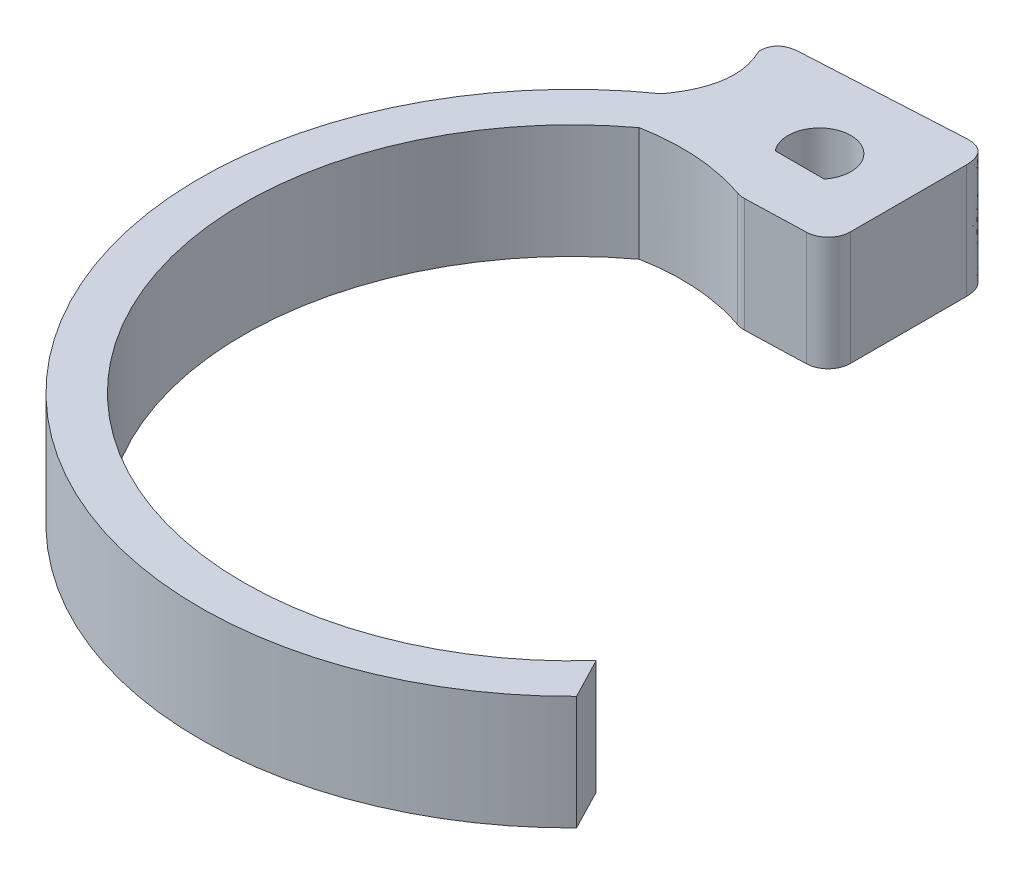
ISO-10303-21;
HEADER;
FILE_DESCRIPTION(('STEP AP214'),'2;1');
FILE_NAME('part.step','',(''),(''),'','','');
FILE_SCHEMA(('AUTOMOTIVE_DESIGN { 1 0 10303 214 1 1 1 1 }'));
ENDSEC;
DATA;
#1=APPLICATION_CONTEXT('core data for automotive mechanical design processes');
#2=APPLICATION_PROTOCOL_DEFINITION('international standard','automotive_design',2000,#1);
#3=PRODUCT_CONTEXT('',#1,'mechanical');
#4=PRODUCT('Part','Part','',(#3));
#5=PRODUCT_RELATED_PRODUCT_CATEGORY('part','',(#4));
#6=PRODUCT_DEFINITION_FORMATION('','',#4);
#7=PRODUCT_DEFINITION_CONTEXT('part definition',#1,'design');
#8=PRODUCT_DEFINITION('design','',#6,#7);
#9=PRODUCT_DEFINITION_SHAPE('','',#8);
#10=(LENGTH_UNIT() NAMED_UNIT(*) SI_UNIT(.MILLI.,.METRE.));
#11=(NAMED_UNIT(*) PLANE_ANGLE_UNIT() SI_UNIT($,.RADIAN.));
#12=(NAMED_UNIT(*) SI_UNIT($,.STERADIAN.) SOLID_ANGLE_UNIT());
#13=UNCERTAINTY_MEASURE_WITH_UNIT(LENGTH_MEASURE(1.E-05),#10,'distance_accuracy_value','');
#14=(GEOMETRIC_REPRESENTATION_CONTEXT(3) GLOBAL_UNCERTAINTY_ASSIGNED_CONTEXT((#13)) GLOBAL_UNIT_ASSIGNED_CONTEXT((#10,
#11,#12)) REPRESENTATION_CONTEXT('',''));
#15=CARTESIAN_POINT('',(0.,0.,0.));
#16=DIRECTION('',(0.,0.,1.));
#17=DIRECTION('',(1.,0.,0.));
#18=AXIS2_PLACEMENT_3D('',#15,#16,#17);
#19=CARTESIAN_POINT('',(-33.0285326066637,6.35,3.74643759327143));
#20=DIRECTION('',(0.,1.,0.));
#21=DIRECTION('',(0.,0.,1.));
#22=AXIS2_PLACEMENT_3D('',#19,#20,#21);
#23=PLANE('',#22);
#24=CARTESIAN_POINT('',(-32.3270124118758,6.35,5.73195544484965));
#25=CARTESIAN_POINT('',(-32.3913833550748,6.35,3.02906188953559));
#26=CARTESIAN_POINT('',(-35.0043513046294,6.35,3.19567114916487));
#27=B_SPLINE_CURVE_WITH_KNOTS('',2,(#24,#25,#26),.UNSPECIFIED.,.F.,.F.,(3,3),(0.,1.),.UNSPECIFIED.);
#28=CARTESIAN_POINT('',(-32.3270124118758,6.35,5.73195544484965));
#29=VERTEX_POINT('',#28);
#30=CARTESIAN_POINT('',(-35.0043513046294,6.35,3.19567114916487));
#31=VERTEX_POINT('',#30);
#32=EDGE_CURVE('E151',#29,#31,#27,.T.);
#33=ORIENTED_EDGE('',*,*,#32,.T.);
#34=DIRECTION('',(-0.998537124285345,0.,0.0540704302179459));
#35=VECTOR('',#34,1.);
#36=CARTESIAN_POINT('',(-52.6004804238313,6.35,4.14849528409798));
#37=LINE('',#36,#35);
#38=CARTESIAN_POINT('',(-52.6004804238313,6.35,4.14849528409798));
#39=VERTEX_POINT('',#38);
#40=EDGE_CURVE('E157',#31,#39,#37,.T.);
#41=ORIENTED_EDGE('',*,*,#40,.T.);
#42=CARTESIAN_POINT('',(-52.6004804238313,6.35,4.14849528409798));
#43=CARTESIAN_POINT('',(-54.8334974610543,6.35,4.29365848902988));
#44=CARTESIAN_POINT('',(-54.8663433490591,6.35,6.3089129925957));
#45=B_SPLINE_CURVE_WITH_KNOTS('',2,(#42,#43,#44),.UNSPECIFIED.,.F.,.F.,(3,3),(0.,1.),.UNSPECIFIED.);
#46=CARTESIAN_POINT('',(-54.8663433490591,6.35,6.3089129925957));
#47=VERTEX_POINT('',#46);
#48=EDGE_CURVE('E163',#39,#47,#45,.T.);
#49=ORIENTED_EDGE('',*,*,#48,.T.);
#50=CARTESIAN_POINT('',(-54.8663433490591,6.35,6.3089129925957));
#51=CARTESIAN_POINT('',(-52.5564098502214,6.35,10.9635190777014));
#52=CARTESIAN_POINT('',(-56.1771965860345,6.35,15.8622607463249));
#53=B_SPLINE_CURVE_WITH_KNOTS('',2,(#50,#51,#52),.UNSPECIFIED.,.F.,.F.,(3,3),(0.,1.),.UNSPECIFIED.);
#54=CARTESIAN_POINT('',(-56.1771965860345,6.35,15.8622607463249));
#55=VERTEX_POINT('',#54);
#56=EDGE_CURVE('E168',#47,#55,#53,.T.);
#57=ORIENTED_EDGE('',*,*,#56,.T.);
#58=CARTESIAN_POINT('',(-32.3270124118697,6.35,49.7143221183813));
#59=DIRECTION('',(0.,1.,0.));
#60=DIRECTION('',(0.,0.,1.));
#61=AXIS2_PLACEMENT_3D('',#58,#59,#60);
#62=CIRCLE('',#61,41.41006332136);
#63=CARTESIAN_POINT('',(-2.77320312475359,6.35,78.7206266210203));
#64=VERTEX_POINT('',#63);
#65=EDGE_CURVE('E337',#55,#64,#62,.T.);
#66=ORIENTED_EDGE('',*,*,#65,.T.);
#67=DIRECTION('',(-0.460408200033211,0.,-0.887707321892852));
#68=VECTOR('',#67,1.);
#69=CARTESIAN_POINT('',(-2.7732031247536,6.35,78.7206266210203));
#70=LINE('',#69,#68);
#71=CARTESIAN_POINT('',(-5.13477903340686,6.35,74.1673014952601));
#72=VERTEX_POINT('',#71);
#73=EDGE_CURVE('E338',#64,#72,#70,.T.);
#74=ORIENTED_EDGE('',*,*,#73,.T.);
#75=CARTESIAN_POINT('',(-32.3270124118697,6.35,49.7143221183813));
#76=DIRECTION('',(0.,-1.,0.));
#77=DIRECTION('',(0.,0.,1.));
#78=AXIS2_PLACEMENT_3D('',#75,#76,#77);
#79=CIRCLE('',#78,36.5700117106196);
#80=CARTESIAN_POINT('',(-54.151069136961,6.35,20.370220418468));
#81=VERTEX_POINT('',#80);
#82=EDGE_CURVE('E232',#72,#81,#79,.T.);
#83=ORIENTED_EDGE('',*,*,#82,.T.);
#84=CARTESIAN_POINT('',(-54.151069136961,6.35,20.370220418468));
#85=CARTESIAN_POINT('',(-50.0948789713038,6.35,19.6117689944451));
#86=CARTESIAN_POINT('',(-46.1430887678935,6.35,19.8926648910228));
#87=CARTESIAN_POINT('',(-42.3517683257354,6.35,21.2019604756439));
#88=B_SPLINE_CURVE_WITH_KNOTS('',3,(#84,#85,#86,#87),.UNSPECIFIED.,.F.,.F.,(4,4),
(0.0362713261030514,1.),.UNSPECIFIED.);
#89=CARTESIAN_POINT('',(-42.3517683257354,6.35,21.2019604756439));
#90=VERTEX_POINT('',#89);
#91=EDGE_CURVE('E225',#81,#90,#88,.T.);
#92=ORIENTED_EDGE('',*,*,#91,.T.);
#93=CARTESIAN_POINT('',(-41.5226520200899,6.35,18.8010926842583));
#94=DIRECTION('',(0.,1.,0.));
#95=DIRECTION('',(0.,0.,1.));
#96=AXIS2_PLACEMENT_3D('',#93,#94,#95);
#97=CIRCLE('',#96,2.54);
#98=CARTESIAN_POINT('',(-41.4470538071266,6.35,21.3399674173235));
#99=VERTEX_POINT('',#98);
#100=EDGE_CURVE('E231',#90,#99,#97,.T.);
#101=ORIENTED_EDGE('',*,*,#100,.T.);
#102=DIRECTION('',(0.999556981521721,0.,-0.0297630759698373));
#103=VECTOR('',#102,1.);
#104=CARTESIAN_POINT('',(-41.4470538071266,6.35,21.3399674173235));
#105=LINE('',#104,#103);
#106=CARTESIAN_POINT('',(-34.7304865443092,6.35,21.139973114452));
#107=VERTEX_POINT('',#106);
#108=EDGE_CURVE('E238',#99,#107,#105,.T.);
#109=ORIENTED_EDGE('',*,*,#108,.T.);
#110=CARTESIAN_POINT('',(-34.8042157350084,6.35,18.663867238166));
#111=DIRECTION('',(0.,1.,0.));
#112=DIRECTION('',(0.,0.,-1.));
#113=AXIS2_PLACEMENT_3D('',#110,#111,#112);
#114=CIRCLE('',#113,2.47720332313253);
#115=CARTESIAN_POINT('',(-32.3270124118758,6.35,18.663867238166));
#116=VERTEX_POINT('',#115);
#117=EDGE_CURVE('E240',#107,#116,#114,.T.);
#118=ORIENTED_EDGE('',*,*,#117,.T.);
#119=DIRECTION('',(0.,0.,-1.));
#120=VECTOR('',#119,1.);
#121=CARTESIAN_POINT('',(-32.3270124118758,6.35,5.73195544484965));
#122=LINE('',#121,#120);
#123=EDGE_CURVE('E242',#116,#29,#122,.T.);
#124=ORIENTED_EDGE('',*,*,#123,.T.);
#125=EDGE_LOOP('',(#33,#41,#49,#57,#66,#74,#83,#92,#101,#109,#118,#124));
#126=FACE_BOUND('',#125,.T.);
#127=DIRECTION('',(-1.,0.,0.));
#128=VECTOR('',#127,1.);
#129=CARTESIAN_POINT('',(-33.0285326066637,6.35,15.0290664283578));
#130=LINE('',#129,#128);
#131=CARTESIAN_POINT('',(-38.8792295394898,6.35,15.0290664283578));
#132=VERTEX_POINT('',#131);
#133=CARTESIAN_POINT('',(-44.328612101864,6.35,15.0290664283578));
#134=VERTEX_POINT('',#133);
#135=EDGE_CURVE('E135',#132,#134,#130,.T.);
#136=ORIENTED_EDGE('',*,*,#135,.T.);
#137=CARTESIAN_POINT('',(-41.6039208206769,6.35,12.8322374813928));
#138=DIRECTION('',(0.,1.,0.));
#139=DIRECTION('',(0.,0.,1.));
#140=AXIS2_PLACEMENT_3D('',#137,#138,#139);
#141=CIRCLE('',#140,3.5);
#142=EDGE_CURVE('E139',#134,#132,#141,.F.);
#143=ORIENTED_EDGE('',*,*,#142,.T.);
#144=EDGE_LOOP('',(#136,#143));
#145=FACE_BOUND('',#144,.T.);
#146=ADVANCED_FACE('F37',(#126,#145),#23,.T.);
#147=CARTESIAN_POINT('',(-33.0285326066637,-6.35,3.74643759327143));
#148=DIRECTION('',(0.,1.,0.));
#149=DIRECTION('',(0.,0.,1.));
#150=AXIS2_PLACEMENT_3D('',#147,#148,#149);
#151=PLANE('',#150);
#152=CARTESIAN_POINT('',(-32.3270124118758,-6.35,5.73195544484965));
#153=CARTESIAN_POINT('',(-32.3913833550748,-6.35,3.02906188953559));
#154=CARTESIAN_POINT('',(-35.0043513046294,-6.35,3.19567114916487));
#155=B_SPLINE_CURVE_WITH_KNOTS('',2,(#152,#153,#154),.UNSPECIFIED.,.F.,.F.,(3,3),(0.,1.),.UNSPECIFIED.);
#156=CARTESIAN_POINT('',(-32.3270124118758,-6.35,5.73195544484965));
#157=VERTEX_POINT('',#156);
#158=CARTESIAN_POINT('',(-35.0043513046294,-6.35,3.19567114916487));
#159=VERTEX_POINT('',#158);
#160=EDGE_CURVE('E146',#157,#159,#155,.T.);
#161=ORIENTED_EDGE('',*,*,#160,.F.);
#162=DIRECTION('',(0.,0.,-1.));
#163=VECTOR('',#162,1.);
#164=CARTESIAN_POINT('',(-32.3270124118758,-6.35,5.73195544484965));
#165=LINE('',#164,#163);
#166=CARTESIAN_POINT('',(-32.3270124118758,-6.35,18.663867238166));
#167=VERTEX_POINT('',#166);
#168=EDGE_CURVE('E158',#167,#157,#165,.T.);
#169=ORIENTED_EDGE('',*,*,#168,.F.);
#170=CARTESIAN_POINT('',(-34.8042157350084,-6.35,18.663867238166));
#171=DIRECTION('',(0.,1.,0.));
#172=DIRECTION('',(0.,0.,-1.));
#173=AXIS2_PLACEMENT_3D('',#170,#171,#172);
#174=CIRCLE('',#173,2.47720332313253);
#175=CARTESIAN_POINT('',(-34.7304865443092,-6.35,21.139973114452));
#176=VERTEX_POINT('',#175);
#177=EDGE_CURVE('E282',#176,#167,#174,.T.);
#178=ORIENTED_EDGE('',*,*,#177,.F.);
#179=DIRECTION('',(0.999556981521721,0.,-0.0297630759698373));
#180=VECTOR('',#179,1.);
#181=CARTESIAN_POINT('',(-41.4470538071266,-6.35,21.3399674173235));
#182=LINE('',#181,#180);
#183=CARTESIAN_POINT('',(-41.4470538071266,-6.35,21.3399674173235));
#184=VERTEX_POINT('',#183);
#185=EDGE_CURVE('E280',#184,#176,#182,.T.);
#186=ORIENTED_EDGE('',*,*,#185,.F.);
#187=CARTESIAN_POINT('',(-41.5226520200899,-6.35,18.8010926842583));
#188=DIRECTION('',(0.,1.,0.));
#189=DIRECTION('',(0.,0.,1.));
#190=AXIS2_PLACEMENT_3D('',#187,#188,#189);
#191=CIRCLE('',#190,2.54);
#192=CARTESIAN_POINT('',(-42.3517683257354,-6.35,21.2019604756439));
#193=VERTEX_POINT('',#192);
#194=EDGE_CURVE('E275',#193,#184,#191,.T.);
#195=ORIENTED_EDGE('',*,*,#194,.F.);
#196=CARTESIAN_POINT('',(-54.151069136961,-6.35,20.370220418468));
#197=CARTESIAN_POINT('',(-50.0948789713038,-6.35,19.6117689944451));
#198=CARTESIAN_POINT('',(-46.1430887678935,-6.35,19.8926648910228));
#199=CARTESIAN_POINT('',(-42.3517683257354,-6.35,21.2019604756439));
#200=B_SPLINE_CURVE_WITH_KNOTS('',3,(#196,#197,#198,#199),.UNSPECIFIED.,.F.,.F.,(4,4),
(0.0362713261030514,1.),.UNSPECIFIED.);
#201=CARTESIAN_POINT('',(-54.151069136961,-6.35,20.370220418468));
#202=VERTEX_POINT('',#201);
#203=EDGE_CURVE('E271',#202,#193,#200,.T.);
#204=ORIENTED_EDGE('',*,*,#203,.F.);
#205=CARTESIAN_POINT('',(-32.3270124118697,-6.35,49.7143221183813));
#206=DIRECTION('',(0.,-1.,0.));
#207=DIRECTION('',(0.,0.,1.));
#208=AXIS2_PLACEMENT_3D('',#205,#206,#207);
#209=CIRCLE('',#208,36.5700117106196);
#210=CARTESIAN_POINT('',(-5.13477903340686,-6.35,74.1673014952601));
#211=VERTEX_POINT('',#210);
#212=EDGE_CURVE('E269',#211,#202,#209,.T.);
#213=ORIENTED_EDGE('',*,*,#212,.F.);
#214=DIRECTION('',(-0.460408200033211,0.,-0.887707321892852));
#215=VECTOR('',#214,1.);
#216=CARTESIAN_POINT('',(-2.7732031247536,-6.35,78.7206266210203));
#217=LINE('',#216,#215);
#218=CARTESIAN_POINT('',(-2.77320312475359,-6.35,78.7206266210203));
#219=VERTEX_POINT('',#218);
#220=EDGE_CURVE('E267',#219,#211,#217,.T.);
#221=ORIENTED_EDGE('',*,*,#220,.F.);
#222=CARTESIAN_POINT('',(-32.3270124118697,-6.35,49.7143221183813));
#223=DIRECTION('',(0.,1.,0.));
#224=DIRECTION('',(0.,0.,1.));
#225=AXIS2_PLACEMENT_3D('',#222,#223,#224);
#226=CIRCLE('',#225,41.41006332136);
#227=CARTESIAN_POINT('',(-56.1771965860345,-6.35,15.8622607463249));
#228=VERTEX_POINT('',#227);
#229=EDGE_CURVE('E262',#228,#219,#226,.T.);
#230=ORIENTED_EDGE('',*,*,#229,.F.);
#231=CARTESIAN_POINT('',(-54.8663433490591,-6.35,6.3089129925957));
#232=CARTESIAN_POINT('',(-52.5564098502214,-6.35,10.9635190777014));
#233=CARTESIAN_POINT('',(-56.1771965860345,-6.35,15.8622607463249));
#234=B_SPLINE_CURVE_WITH_KNOTS('',2,(#231,#232,#233),.UNSPECIFIED.,.F.,.F.,(3,3),(0.,1.),.UNSPECIFIED.);
#235=CARTESIAN_POINT('',(-54.8663433490591,-6.35,6.3089129925957));
#236=VERTEX_POINT('',#235);
#237=EDGE_CURVE('E255',#236,#228,#234,.T.);
#238=ORIENTED_EDGE('',*,*,#237,.F.);
#239=CARTESIAN_POINT('',(-52.6004804238313,-6.35,4.14849528409798));
#240=CARTESIAN_POINT('',(-54.8334974610543,-6.35,4.29365848902988));
#241=CARTESIAN_POINT('',(-54.8663433490591,-6.35,6.3089129925957));
#242=B_SPLINE_CURVE_WITH_KNOTS('',2,(#239,#240,#241),.UNSPECIFIED.,.F.,.F.,(3,3),(0.,1.),.UNSPECIFIED.);
#243=CARTESIAN_POINT('',(-52.6004804238313,-6.35,4.14849528409798));
#244=VERTEX_POINT('',#243);
#245=EDGE_CURVE('E251',#244,#236,#242,.T.);
#246=ORIENTED_EDGE('',*,*,#245,.F.);
#247=DIRECTION('',(-0.998537124285345,0.,0.0540704302179459));
#248=VECTOR('',#247,1.);
#249=CARTESIAN_POINT('',(-52.6004804238313,-6.35,4.14849528409798));
#250=LINE('',#249,#248);
#251=EDGE_CURVE('E149',#159,#244,#250,.T.);
#252=ORIENTED_EDGE('',*,*,#251,.F.);
#253=EDGE_LOOP('',(#161,#169,#178,#186,#195,#204,#213,#221,#230,#238,#246,#252));
#254=FACE_BOUND('',#253,.T.);
#255=CARTESIAN_POINT('',(-41.6039208206769,-6.35,12.8322374813928));
#256=DIRECTION('',(0.,1.,0.));
#257=DIRECTION('',(0.,0.,1.));
#258=AXIS2_PLACEMENT_3D('',#255,#256,#257);
#259=CIRCLE('',#258,3.5);
#260=CARTESIAN_POINT('',(-44.328612101864,-6.35,15.0290664283578));
#261=VERTEX_POINT('',#260);
#262=CARTESIAN_POINT('',(-38.8792295394898,-6.35,15.0290664283578));
#263=VERTEX_POINT('',#262);
#264=EDGE_CURVE('E11',#261,#263,#259,.F.);
#265=ORIENTED_EDGE('',*,*,#264,.F.);
#266=DIRECTION('',(-1.,0.,0.));
#267=VECTOR('',#266,1.);
#268=CARTESIAN_POINT('',(-33.0285326066637,-6.35,15.0290664283578));
#269=LINE('',#268,#267);
#270=EDGE_CURVE('E46',#263,#261,#269,.T.);
#271=ORIENTED_EDGE('',*,*,#270,.F.);
#272=EDGE_LOOP('',(#265,#271));
#273=FACE_BOUND('',#272,.T.);
#274=ADVANCED_FACE('F189',(#254,#273),#151,.F.);
#275=DIRECTION('',(0.,-1.,0.));
#276=VECTOR('',#275,1.);
#277=SURFACE_OF_LINEAR_EXTRUSION('',#27,#276);
#278=ORIENTED_EDGE('',*,*,#160,.T.);
#279=DIRECTION('',(0.,-1.,0.));
#280=VECTOR('',#279,1.);
#281=CARTESIAN_POINT('',(-35.0043513046294,6.35,3.19567114916487));
#282=LINE('',#281,#280);
#283=EDGE_CURVE('E317',#31,#159,#282,.T.);
#284=ORIENTED_EDGE('',*,*,#283,.F.);
#285=ORIENTED_EDGE('',*,*,#32,.F.);
#286=DIRECTION('',(0.,-1.,0.));
#287=VECTOR('',#286,1.);
#288=CARTESIAN_POINT('',(-32.3270124118758,6.35,5.73195544484965));
#289=LINE('',#288,#287);
#290=EDGE_CURVE('E243',#29,#157,#289,.T.);
#291=ORIENTED_EDGE('',*,*,#290,.T.);
#292=EDGE_LOOP('',(#278,#284,#285,#291));
#293=FACE_BOUND('',#292,.T.);
#294=ADVANCED_FACE('F39',(#293),#277,.F.);
#295=CARTESIAN_POINT('',(-52.6004804238313,6.35,4.14849528409798));
#296=DIRECTION('',(0.054070430217946,0.,0.998537124285345));
#297=DIRECTION('',(0.998537124285345,0.,-0.054070430217946));
#298=AXIS2_PLACEMENT_3D('',#295,#296,#297);
#299=PLANE('',#298);
#300=ORIENTED_EDGE('',*,*,#251,.T.);
#301=DIRECTION('',(0.,-1.,0.));
#302=VECTOR('',#301,1.);
#303=CARTESIAN_POINT('',(-52.6004804238313,6.35,4.14849528409798));
#304=LINE('',#303,#302);
#305=EDGE_CURVE('E314',#39,#244,#304,.T.);
#306=ORIENTED_EDGE('',*,*,#305,.F.);
#307=ORIENTED_EDGE('',*,*,#40,.F.);
#308=ORIENTED_EDGE('',*,*,#283,.T.);
#309=EDGE_LOOP('',(#300,#306,#307,#308));
#310=FACE_BOUND('',#309,.T.);
#311=ADVANCED_FACE('F181',(#310),#299,.F.);
#312=DIRECTION('',(0.,-1.,0.));
#313=VECTOR('',#312,1.);
#314=SURFACE_OF_LINEAR_EXTRUSION('',#45,#313);
#315=ORIENTED_EDGE('',*,*,#245,.T.);
#316=DIRECTION('',(0.,-1.,0.));
#317=VECTOR('',#316,1.);
#318=CARTESIAN_POINT('',(-54.8663433490591,6.35,6.3089129925957));
#319=LINE('',#318,#317);
#320=EDGE_CURVE('E311',#47,#236,#319,.T.);
#321=ORIENTED_EDGE('',*,*,#320,.F.);
#322=ORIENTED_EDGE('',*,*,#48,.F.);
#323=ORIENTED_EDGE('',*,*,#305,.T.);
#324=EDGE_LOOP('',(#315,#321,#322,#323));
#325=FACE_BOUND('',#324,.T.);
#326=ADVANCED_FACE('F177',(#325),#314,.F.);
#327=DIRECTION('',(0.,-1.,0.));
#328=VECTOR('',#327,1.);
#329=SURFACE_OF_LINEAR_EXTRUSION('',#53,#328);
#330=ORIENTED_EDGE('',*,*,#237,.T.);
#331=DIRECTION('',(0.,-1.,0.));
#332=VECTOR('',#331,1.);
#333=CARTESIAN_POINT('',(-56.1771965860345,6.35,15.8622607463249));
#334=LINE('',#333,#332);
#335=EDGE_CURVE('E308',#55,#228,#334,.T.);
#336=ORIENTED_EDGE('',*,*,#335,.F.);
#337=ORIENTED_EDGE('',*,*,#56,.F.);
#338=ORIENTED_EDGE('',*,*,#320,.T.);
#339=EDGE_LOOP('',(#330,#336,#337,#338));
#340=FACE_BOUND('',#339,.T.);
#341=ADVANCED_FACE('F180',(#340),#329,.F.);
#342=CARTESIAN_POINT('',(-32.3270124118697,6.35,49.7143221183813));
#343=DIRECTION('',(0.,-1.,0.));
#344=DIRECTION('',(0.,0.,-1.));
#345=AXIS2_PLACEMENT_3D('',#342,#343,#344);
#346=CYLINDRICAL_SURFACE('',#345,41.41006332136);
#347=ORIENTED_EDGE('',*,*,#229,.T.);
#348=DIRECTION('',(0.,-1.,0.));
#349=VECTOR('',#348,1.);
#350=CARTESIAN_POINT('',(-2.77320312475359,6.35,78.7206266210203));
#351=LINE('',#350,#349);
#352=EDGE_CURVE('E305',#64,#219,#351,.T.);
#353=ORIENTED_EDGE('',*,*,#352,.F.);
#354=ORIENTED_EDGE('',*,*,#65,.F.);
#355=ORIENTED_EDGE('',*,*,#335,.T.);
#356=EDGE_LOOP('',(#347,#353,#354,#355));
#357=FACE_BOUND('',#356,.T.);
#358=ADVANCED_FACE('F362',(#357),#346,.T.);
#359=CARTESIAN_POINT('',(-2.7732031247536,6.35,78.7206266210203));
#360=DIRECTION('',(-0.887707321892852,0.,0.460408200033211));
#361=DIRECTION('',(0.460408200033211,0.,0.887707321892852));
#362=AXIS2_PLACEMENT_3D('',#359,#360,#361);
#363=PLANE('',#362);
#364=ORIENTED_EDGE('',*,*,#220,.T.);
#365=DIRECTION('',(0.,-1.,0.));
#366=VECTOR('',#365,1.);
#367=CARTESIAN_POINT('',(-5.13477903340686,6.35,74.1673014952601));
#368=LINE('',#367,#366);
#369=EDGE_CURVE('E302',#72,#211,#368,.T.);
#370=ORIENTED_EDGE('',*,*,#369,.F.);
#371=ORIENTED_EDGE('',*,*,#73,.F.);
#372=ORIENTED_EDGE('',*,*,#352,.T.);
#373=EDGE_LOOP('',(#364,#370,#371,#372));
#374=FACE_BOUND('',#373,.T.);
#375=ADVANCED_FACE('F360',(#374),#363,.F.);
#376=CARTESIAN_POINT('',(-32.3270124118697,6.35,49.7143221183813));
#377=DIRECTION('',(0.,-1.,0.));
#378=DIRECTION('',(0.,0.,-1.));
#379=AXIS2_PLACEMENT_3D('',#376,#377,#378);
#380=CYLINDRICAL_SURFACE('',#379,36.5700117106196);
#381=ORIENTED_EDGE('',*,*,#212,.T.);
#382=DIRECTION('',(0.,-1.,0.));
#383=VECTOR('',#382,1.);
#384=CARTESIAN_POINT('',(-54.151069136961,6.35,20.370220418468));
#385=LINE('',#384,#383);
#386=EDGE_CURVE('E299',#81,#202,#385,.T.);
#387=ORIENTED_EDGE('',*,*,#386,.F.);
#388=ORIENTED_EDGE('',*,*,#82,.F.);
#389=ORIENTED_EDGE('',*,*,#369,.T.);
#390=EDGE_LOOP('',(#381,#387,#388,#389));
#391=FACE_BOUND('',#390,.T.);
#392=ADVANCED_FACE('F222',(#391),#380,.F.);
#393=DIRECTION('',(0.,-1.,0.));
#394=VECTOR('',#393,1.);
#395=SURFACE_OF_LINEAR_EXTRUSION('',#88,#394);
#396=ORIENTED_EDGE('',*,*,#203,.T.);
#397=DIRECTION('',(0.,-1.,0.));
#398=VECTOR('',#397,1.);
#399=CARTESIAN_POINT('',(-42.3517683257354,6.35,21.2019604756439));
#400=LINE('',#399,#398);
#401=EDGE_CURVE('E296',#90,#193,#400,.T.);
#402=ORIENTED_EDGE('',*,*,#401,.F.);
#403=ORIENTED_EDGE('',*,*,#91,.F.);
#404=ORIENTED_EDGE('',*,*,#386,.T.);
#405=EDGE_LOOP('',(#396,#402,#403,#404));
#406=FACE_BOUND('',#405,.T.);
#407=ADVANCED_FACE('F217',(#406),#395,.F.);
#408=CARTESIAN_POINT('',(-41.5226520200899,6.35,18.8010926842583));
#409=DIRECTION('',(0.,-1.,0.));
#410=DIRECTION('',(0.,0.,-1.));
#411=AXIS2_PLACEMENT_3D('',#408,#409,#410);
#412=CYLINDRICAL_SURFACE('',#411,2.54);
#413=ORIENTED_EDGE('',*,*,#194,.T.);
#414=DIRECTION('',(0.,-1.,0.));
#415=VECTOR('',#414,1.);
#416=CARTESIAN_POINT('',(-41.4470538071266,6.35,21.3399674173235));
#417=LINE('',#416,#415);
#418=EDGE_CURVE('E293',#99,#184,#417,.T.);
#419=ORIENTED_EDGE('',*,*,#418,.F.);
#420=ORIENTED_EDGE('',*,*,#100,.F.);
#421=ORIENTED_EDGE('',*,*,#401,.T.);
#422=EDGE_LOOP('',(#413,#419,#420,#421));
#423=FACE_BOUND('',#422,.T.);
#424=ADVANCED_FACE('F213',(#423),#412,.T.);
#425=CARTESIAN_POINT('',(-41.4470538071266,6.35,21.3399674173235));
#426=DIRECTION('',(-0.0297630759698373,0.,-0.999556981521721));
#427=DIRECTION('',(-0.999556981521721,0.,0.0297630759698373));
#428=AXIS2_PLACEMENT_3D('',#425,#426,#427);
#429=PLANE('',#428);
#430=ORIENTED_EDGE('',*,*,#185,.T.);
#431=DIRECTION('',(0.,-1.,0.));
#432=VECTOR('',#431,1.);
#433=CARTESIAN_POINT('',(-34.7304865443092,6.35,21.139973114452));
#434=LINE('',#433,#432);
#435=EDGE_CURVE('E290',#107,#176,#434,.T.);
#436=ORIENTED_EDGE('',*,*,#435,.F.);
#437=ORIENTED_EDGE('',*,*,#108,.F.);
#438=ORIENTED_EDGE('',*,*,#418,.T.);
#439=EDGE_LOOP('',(#430,#436,#437,#438));
#440=FACE_BOUND('',#439,.T.);
#441=ADVANCED_FACE('F209',(#440),#429,.F.);
#442=CARTESIAN_POINT('',(-34.8042157350084,6.35,18.663867238166));
#443=DIRECTION('',(0.,-1.,0.));
#444=DIRECTION('',(0.,0.,-1.));
#445=AXIS2_PLACEMENT_3D('',#442,#443,#444);
#446=CYLINDRICAL_SURFACE('',#445,2.47720332313253);
#447=ORIENTED_EDGE('',*,*,#177,.T.);
#448=DIRECTION('',(0.,-1.,0.));
#449=VECTOR('',#448,1.);
#450=CARTESIAN_POINT('',(-32.3270124118758,6.35,18.663867238166));
#451=LINE('',#450,#449);
#452=EDGE_CURVE('E287',#116,#167,#451,.T.);
#453=ORIENTED_EDGE('',*,*,#452,.F.);
#454=ORIENTED_EDGE('',*,*,#117,.F.);
#455=ORIENTED_EDGE('',*,*,#435,.T.);
#456=EDGE_LOOP('',(#447,#453,#454,#455));
#457=FACE_BOUND('',#456,.T.);
#458=ADVANCED_FACE('F205',(#457),#446,.T.);
#459=CARTESIAN_POINT('',(-32.3270124118758,6.35,5.73195544484965));
#460=DIRECTION('',(-1.,0.,0.));
#461=DIRECTION('',(0.,0.,1.));
#462=AXIS2_PLACEMENT_3D('',#459,#460,#461);
#463=PLANE('',#462);
#464=ORIENTED_EDGE('',*,*,#168,.T.);
#465=ORIENTED_EDGE('',*,*,#290,.F.);
#466=ORIENTED_EDGE('',*,*,#123,.F.);
#467=ORIENTED_EDGE('',*,*,#452,.T.);
#468=EDGE_LOOP('',(#464,#465,#466,#467));
#469=FACE_BOUND('',#468,.T.);
#470=ADVANCED_FACE('F202',(#469),#463,.F.);
#471=CARTESIAN_POINT('',(-41.6039208206769,-6.604,12.8322374813928));
#472=DIRECTION('',(0.,1.,0.));
#473=DIRECTION('',(0.,0.,1.));
#474=AXIS2_PLACEMENT_3D('',#471,#472,#473);
#475=CYLINDRICAL_SURFACE('',#474,3.5);
#476=DIRECTION('',(0.,1.,0.));
#477=VECTOR('',#476,1.);
#478=CARTESIAN_POINT('',(-44.328612101864,-6.604,15.0290664283578));
#479=LINE('',#478,#477);
#480=EDGE_CURVE('E53',#261,#134,#479,.T.);
#481=ORIENTED_EDGE('',*,*,#480,.F.);
#482=ORIENTED_EDGE('',*,*,#264,.T.);
#483=DIRECTION('',(0.,1.,0.));
#484=VECTOR('',#483,1.);
#485=CARTESIAN_POINT('',(-38.8792295394898,-6.604,15.0290664283578));
#486=LINE('',#485,#484);
#487=EDGE_CURVE('E58',#263,#132,#486,.T.);
#488=ORIENTED_EDGE('',*,*,#487,.T.);
#489=ORIENTED_EDGE('',*,*,#142,.F.);
#490=EDGE_LOOP('',(#481,#482,#488,#489));
#491=FACE_BOUND('',#490,.T.);
#492=ADVANCED_FACE('F142',(#491),#475,.F.);
#493=CARTESIAN_POINT('',(-38.8792295394898,-6.604,15.0290664283578));
#494=DIRECTION('',(0.,0.,-1.));
#495=DIRECTION('',(-1.,0.,0.));
#496=AXIS2_PLACEMENT_3D('',#493,#494,#495);
#497=PLANE('',#496);
#498=ORIENTED_EDGE('',*,*,#487,.F.);
#499=ORIENTED_EDGE('',*,*,#270,.T.);
#500=ORIENTED_EDGE('',*,*,#480,.T.);
#501=ORIENTED_EDGE('',*,*,#135,.F.);
#502=EDGE_LOOP('',(#498,#499,#500,#501));
#503=FACE_BOUND('',#502,.T.);
#504=ADVANCED_FACE('F136',(#503),#497,.T.);
#505=CLOSED_SHELL('',(#146,#274,#294,#311,#326,#341,#358,#375,#392,#407,#424,#441,#458,#470,
#492,#504));
#506=MANIFOLD_SOLID_BREP('B2',#505);
#507=ADVANCED_BREP_SHAPE_REPRESENTATION('',(#18,#506),#14);
#508=SHAPE_DEFINITION_REPRESENTATION(#9,#507);
ENDSEC;
END-ISO-10303-21;
